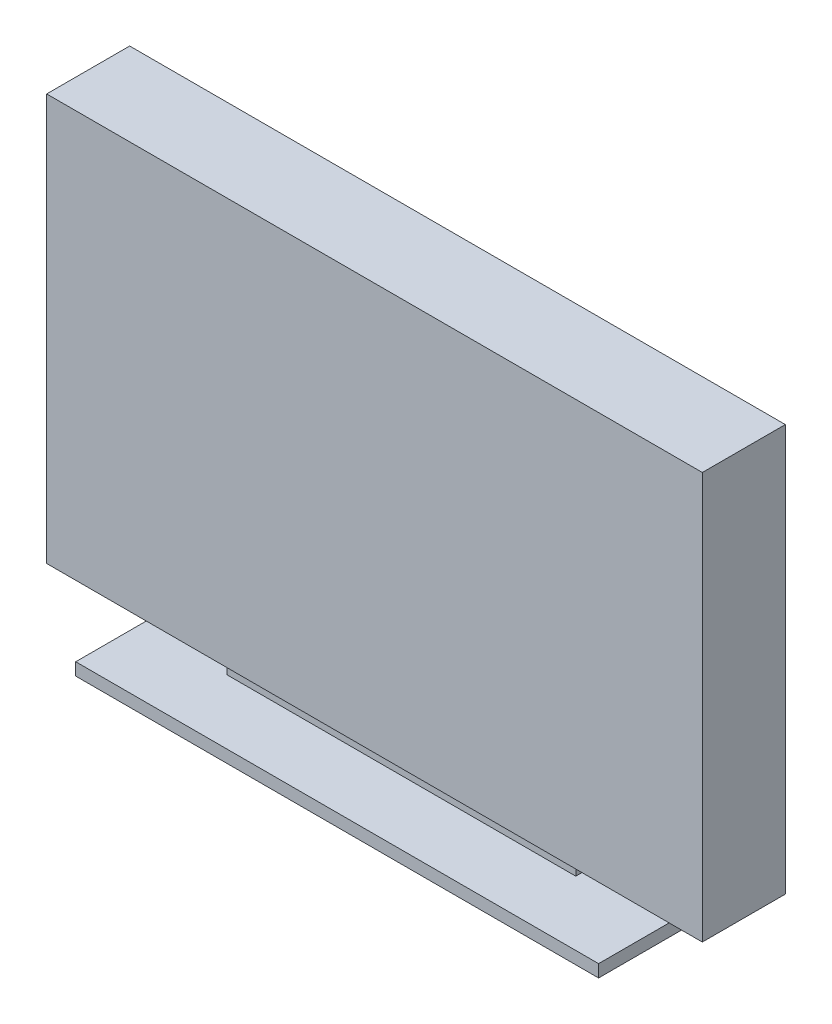
ISO-10303-21;
HEADER;
FILE_DESCRIPTION(('STEP AP214'),'2;1');
FILE_NAME('part.step','',(''),(''),'','','');
FILE_SCHEMA(('AUTOMOTIVE_DESIGN { 1 0 10303 214 1 1 1 1 }'));
ENDSEC;
DATA;
#1=APPLICATION_CONTEXT('core data for automotive mechanical design processes');
#2=APPLICATION_PROTOCOL_DEFINITION('international standard','automotive_design',2000,#1);
#3=PRODUCT_CONTEXT('',#1,'mechanical');
#4=PRODUCT('Part','Part','',(#3));
#5=PRODUCT_RELATED_PRODUCT_CATEGORY('part','',(#4));
#6=PRODUCT_DEFINITION_FORMATION('','',#4);
#7=PRODUCT_DEFINITION_CONTEXT('part definition',#1,'design');
#8=PRODUCT_DEFINITION('design','',#6,#7);
#9=PRODUCT_DEFINITION_SHAPE('','',#8);
#10=(LENGTH_UNIT() NAMED_UNIT(*) SI_UNIT(.MILLI.,.METRE.));
#11=(NAMED_UNIT(*) PLANE_ANGLE_UNIT() SI_UNIT($,.RADIAN.));
#12=(NAMED_UNIT(*) SI_UNIT($,.STERADIAN.) SOLID_ANGLE_UNIT());
#13=UNCERTAINTY_MEASURE_WITH_UNIT(LENGTH_MEASURE(1.E-05),#10,'distance_accuracy_value','');
#14=(GEOMETRIC_REPRESENTATION_CONTEXT(3) GLOBAL_UNCERTAINTY_ASSIGNED_CONTEXT((#13)) GLOBAL_UNIT_ASSIGNED_CONTEXT((#10,
#11,#12)) REPRESENTATION_CONTEXT('',''));
#15=CARTESIAN_POINT('',(0.,0.,0.));
#16=DIRECTION('',(0.,0.,1.));
#17=DIRECTION('',(1.,0.,0.));
#18=AXIS2_PLACEMENT_3D('',#15,#16,#17);
#19=CARTESIAN_POINT('',(0.,15.,0.));
#20=DIRECTION('',(0.,-1.,0.));
#21=DIRECTION('',(0.,0.,-1.));
#22=AXIS2_PLACEMENT_3D('',#19,#20,#21);
#23=PLANE('',#22);
#24=DIRECTION('',(0.,0.,-1.));
#25=VECTOR('',#24,1.);
#26=CARTESIAN_POINT('',(315.,15.,95.));
#27=LINE('',#26,#25);
#28=CARTESIAN_POINT('',(315.,15.,95.));
#29=VERTEX_POINT('',#28);
#30=CARTESIAN_POINT('',(315.,15.,-95.));
#31=VERTEX_POINT('',#30);
#32=EDGE_CURVE('E182',#29,#31,#27,.T.);
#33=ORIENTED_EDGE('',*,*,#32,.T.);
#34=DIRECTION('',(-1.,0.,0.));
#35=VECTOR('',#34,1.);
#36=CARTESIAN_POINT('',(-315.,15.,-95.));
#37=LINE('',#36,#35);
#38=CARTESIAN_POINT('',(-315.,15.,-95.));
#39=VERTEX_POINT('',#38);
#40=EDGE_CURVE('E185',#31,#39,#37,.T.);
#41=ORIENTED_EDGE('',*,*,#40,.T.);
#42=DIRECTION('',(0.,0.,1.));
#43=VECTOR('',#42,1.);
#44=CARTESIAN_POINT('',(-315.,15.,95.));
#45=LINE('',#44,#43);
#46=CARTESIAN_POINT('',(-315.,15.,95.));
#47=VERTEX_POINT('',#46);
#48=EDGE_CURVE('E188',#39,#47,#45,.T.);
#49=ORIENTED_EDGE('',*,*,#48,.T.);
#50=DIRECTION('',(1.,0.,0.));
#51=VECTOR('',#50,1.);
#52=CARTESIAN_POINT('',(-315.,15.,95.));
#53=LINE('',#52,#51);
#54=EDGE_CURVE('E190',#47,#29,#53,.T.);
#55=ORIENTED_EDGE('',*,*,#54,.T.);
#56=EDGE_LOOP('',(#33,#41,#49,#55));
#57=FACE_BOUND('',#56,.T.);
#58=DIRECTION('',(0.,0.,-1.));
#59=VECTOR('',#58,1.);
#60=CARTESIAN_POINT('',(210.,15.,17.5));
#61=LINE('',#60,#59);
#62=CARTESIAN_POINT('',(210.,15.,17.5));
#63=VERTEX_POINT('',#62);
#64=CARTESIAN_POINT('',(210.,15.,-17.5));
#65=VERTEX_POINT('',#64);
#66=EDGE_CURVE('E145',#63,#65,#61,.T.);
#67=ORIENTED_EDGE('',*,*,#66,.F.);
#68=DIRECTION('',(1.,0.,0.));
#69=VECTOR('',#68,1.);
#70=CARTESIAN_POINT('',(-210.,15.,17.5));
#71=LINE('',#70,#69);
#72=CARTESIAN_POINT('',(-210.,15.,17.5));
#73=VERTEX_POINT('',#72);
#74=EDGE_CURVE('E157',#73,#63,#71,.T.);
#75=ORIENTED_EDGE('',*,*,#74,.F.);
#76=DIRECTION('',(0.,0.,1.));
#77=VECTOR('',#76,1.);
#78=CARTESIAN_POINT('',(-210.,15.,17.5));
#79=LINE('',#78,#77);
#80=CARTESIAN_POINT('',(-210.,15.,-17.5));
#81=VERTEX_POINT('',#80);
#82=EDGE_CURVE('E53',#81,#73,#79,.T.);
#83=ORIENTED_EDGE('',*,*,#82,.F.);
#84=DIRECTION('',(-1.,0.,0.));
#85=VECTOR('',#84,1.);
#86=CARTESIAN_POINT('',(-210.,15.,-17.5));
#87=LINE('',#86,#85);
#88=EDGE_CURVE('E48',#65,#81,#87,.T.);
#89=ORIENTED_EDGE('',*,*,#88,.F.);
#90=EDGE_LOOP('',(#67,#75,#83,#89));
#91=FACE_BOUND('',#90,.T.);
#92=ADVANCED_FACE('F33',(#57,#91),#23,.F.);
#93=CARTESIAN_POINT('',(315.,15.,95.));
#94=DIRECTION('',(-1.,0.,0.));
#95=DIRECTION('',(0.,0.,1.));
#96=AXIS2_PLACEMENT_3D('',#93,#94,#95);
#97=PLANE('',#96);
#98=DIRECTION('',(0.,0.,-1.));
#99=VECTOR('',#98,1.);
#100=CARTESIAN_POINT('',(315.,0.,95.));
#101=LINE('',#100,#99);
#102=CARTESIAN_POINT('',(315.,0.,95.));
#103=VERTEX_POINT('',#102);
#104=CARTESIAN_POINT('',(315.,0.,-95.));
#105=VERTEX_POINT('',#104);
#106=EDGE_CURVE('E181',#103,#105,#101,.T.);
#107=ORIENTED_EDGE('',*,*,#106,.T.);
#108=DIRECTION('',(0.,-1.,0.));
#109=VECTOR('',#108,1.);
#110=CARTESIAN_POINT('',(315.,15.,-95.));
#111=LINE('',#110,#109);
#112=EDGE_CURVE('E11',#31,#105,#111,.T.);
#113=ORIENTED_EDGE('',*,*,#112,.F.);
#114=ORIENTED_EDGE('',*,*,#32,.F.);
#115=DIRECTION('',(0.,-1.,0.));
#116=VECTOR('',#115,1.);
#117=CARTESIAN_POINT('',(315.,15.,95.));
#118=LINE('',#117,#116);
#119=EDGE_CURVE('E192',#29,#103,#118,.T.);
#120=ORIENTED_EDGE('',*,*,#119,.T.);
#121=EDGE_LOOP('',(#107,#113,#114,#120));
#122=FACE_BOUND('',#121,.T.);
#123=ADVANCED_FACE('F35',(#122),#97,.F.);
#124=CARTESIAN_POINT('',(-315.,15.,-95.));
#125=DIRECTION('',(0.,0.,1.));
#126=DIRECTION('',(1.,0.,0.));
#127=AXIS2_PLACEMENT_3D('',#124,#125,#126);
#128=PLANE('',#127);
#129=DIRECTION('',(-1.,0.,0.));
#130=VECTOR('',#129,1.);
#131=CARTESIAN_POINT('',(-315.,0.,-95.));
#132=LINE('',#131,#130);
#133=CARTESIAN_POINT('',(-315.,0.,-95.));
#134=VERTEX_POINT('',#133);
#135=EDGE_CURVE('E195',#105,#134,#132,.T.);
#136=ORIENTED_EDGE('',*,*,#135,.T.);
#137=DIRECTION('',(0.,-1.,0.));
#138=VECTOR('',#137,1.);
#139=CARTESIAN_POINT('',(-315.,15.,-95.));
#140=LINE('',#139,#138);
#141=EDGE_CURVE('E41',#39,#134,#140,.T.);
#142=ORIENTED_EDGE('',*,*,#141,.F.);
#143=ORIENTED_EDGE('',*,*,#40,.F.);
#144=ORIENTED_EDGE('',*,*,#112,.T.);
#145=EDGE_LOOP('',(#136,#142,#143,#144));
#146=FACE_BOUND('',#145,.T.);
#147=ADVANCED_FACE('F224',(#146),#128,.F.);
#148=CARTESIAN_POINT('',(-315.,15.,95.));
#149=DIRECTION('',(1.,0.,0.));
#150=DIRECTION('',(0.,0.,-1.));
#151=AXIS2_PLACEMENT_3D('',#148,#149,#150);
#152=PLANE('',#151);
#153=DIRECTION('',(0.,0.,1.));
#154=VECTOR('',#153,1.);
#155=CARTESIAN_POINT('',(-315.,0.,95.));
#156=LINE('',#155,#154);
#157=CARTESIAN_POINT('',(-315.,0.,95.));
#158=VERTEX_POINT('',#157);
#159=EDGE_CURVE('E197',#134,#158,#156,.T.);
#160=ORIENTED_EDGE('',*,*,#159,.T.);
#161=DIRECTION('',(0.,-1.,0.));
#162=VECTOR('',#161,1.);
#163=CARTESIAN_POINT('',(-315.,15.,95.));
#164=LINE('',#163,#162);
#165=EDGE_CURVE('E202',#47,#158,#164,.T.);
#166=ORIENTED_EDGE('',*,*,#165,.F.);
#167=ORIENTED_EDGE('',*,*,#48,.F.);
#168=ORIENTED_EDGE('',*,*,#141,.T.);
#169=EDGE_LOOP('',(#160,#166,#167,#168));
#170=FACE_BOUND('',#169,.T.);
#171=ADVANCED_FACE('F209',(#170),#152,.F.);
#172=CARTESIAN_POINT('',(-315.,15.,95.));
#173=DIRECTION('',(0.,0.,-1.));
#174=DIRECTION('',(-1.,0.,0.));
#175=AXIS2_PLACEMENT_3D('',#172,#173,#174);
#176=PLANE('',#175);
#177=DIRECTION('',(1.,0.,0.));
#178=VECTOR('',#177,1.);
#179=CARTESIAN_POINT('',(-315.,0.,95.));
#180=LINE('',#179,#178);
#181=EDGE_CURVE('E186',#158,#103,#180,.T.);
#182=ORIENTED_EDGE('',*,*,#181,.T.);
#183=ORIENTED_EDGE('',*,*,#119,.F.);
#184=ORIENTED_EDGE('',*,*,#54,.F.);
#185=ORIENTED_EDGE('',*,*,#165,.T.);
#186=EDGE_LOOP('',(#182,#183,#184,#185));
#187=FACE_BOUND('',#186,.T.);
#188=ADVANCED_FACE('F218',(#187),#176,.F.);
#189=CARTESIAN_POINT('',(0.,0.,0.));
#190=DIRECTION('',(0.,-1.,0.));
#191=DIRECTION('',(0.,0.,-1.));
#192=AXIS2_PLACEMENT_3D('',#189,#190,#191);
#193=PLANE('',#192);
#194=ORIENTED_EDGE('',*,*,#106,.F.);
#195=ORIENTED_EDGE('',*,*,#181,.F.);
#196=ORIENTED_EDGE('',*,*,#159,.F.);
#197=ORIENTED_EDGE('',*,*,#135,.F.);
#198=EDGE_LOOP('',(#194,#195,#196,#197));
#199=FACE_BOUND('',#198,.T.);
#200=ADVANCED_FACE('F215',(#199),#193,.T.);
#201=CARTESIAN_POINT('',(210.,55.,17.5));
#202=DIRECTION('',(-1.,0.,0.));
#203=DIRECTION('',(0.,0.,1.));
#204=AXIS2_PLACEMENT_3D('',#201,#202,#203);
#205=PLANE('',#204);
#206=ORIENTED_EDGE('',*,*,#66,.T.);
#207=DIRECTION('',(0.,-1.,0.));
#208=VECTOR('',#207,1.);
#209=CARTESIAN_POINT('',(210.,55.,-17.5));
#210=LINE('',#209,#208);
#211=CARTESIAN_POINT('',(210.,55.,-17.5));
#212=VERTEX_POINT('',#211);
#213=EDGE_CURVE('E179',#212,#65,#210,.T.);
#214=ORIENTED_EDGE('',*,*,#213,.F.);
#215=DIRECTION('',(0.,0.,-1.));
#216=VECTOR('',#215,1.);
#217=CARTESIAN_POINT('',(210.,55.,17.5));
#218=LINE('',#217,#216);
#219=CARTESIAN_POINT('',(210.,55.,17.5));
#220=VERTEX_POINT('',#219);
#221=EDGE_CURVE('E153',#220,#212,#218,.T.);
#222=ORIENTED_EDGE('',*,*,#221,.F.);
#223=DIRECTION('',(0.,-1.,0.));
#224=VECTOR('',#223,1.);
#225=CARTESIAN_POINT('',(210.,55.,17.5));
#226=LINE('',#225,#224);
#227=EDGE_CURVE('E165',#220,#63,#226,.T.);
#228=ORIENTED_EDGE('',*,*,#227,.T.);
#229=EDGE_LOOP('',(#206,#214,#222,#228));
#230=FACE_BOUND('',#229,.T.);
#231=ADVANCED_FACE('F237',(#230),#205,.F.);
#232=CARTESIAN_POINT('',(-210.,55.,-17.5));
#233=DIRECTION('',(0.,0.,1.));
#234=DIRECTION('',(1.,0.,0.));
#235=AXIS2_PLACEMENT_3D('',#232,#233,#234);
#236=PLANE('',#235);
#237=ORIENTED_EDGE('',*,*,#88,.T.);
#238=DIRECTION('',(0.,-1.,0.));
#239=VECTOR('',#238,1.);
#240=CARTESIAN_POINT('',(-210.,55.,-17.5));
#241=LINE('',#240,#239);
#242=CARTESIAN_POINT('',(-210.,55.,-17.5));
#243=VERTEX_POINT('',#242);
#244=EDGE_CURVE('E176',#243,#81,#241,.T.);
#245=ORIENTED_EDGE('',*,*,#244,.F.);
#246=DIRECTION('',(-1.,0.,0.));
#247=VECTOR('',#246,1.);
#248=CARTESIAN_POINT('',(-210.,55.,-17.5));
#249=LINE('',#248,#247);
#250=EDGE_CURVE('E156',#212,#243,#249,.T.);
#251=ORIENTED_EDGE('',*,*,#250,.F.);
#252=ORIENTED_EDGE('',*,*,#213,.T.);
#253=EDGE_LOOP('',(#237,#245,#251,#252));
#254=FACE_BOUND('',#253,.T.);
#255=ADVANCED_FACE('F256',(#254),#236,.F.);
#256=CARTESIAN_POINT('',(-210.,55.,17.5));
#257=DIRECTION('',(1.,0.,0.));
#258=DIRECTION('',(0.,0.,-1.));
#259=AXIS2_PLACEMENT_3D('',#256,#257,#258);
#260=PLANE('',#259);
#261=ORIENTED_EDGE('',*,*,#82,.T.);
#262=DIRECTION('',(0.,-1.,0.));
#263=VECTOR('',#262,1.);
#264=CARTESIAN_POINT('',(-210.,55.,17.5));
#265=LINE('',#264,#263);
#266=CARTESIAN_POINT('',(-210.,55.,17.5));
#267=VERTEX_POINT('',#266);
#268=EDGE_CURVE('E173',#267,#73,#265,.T.);
#269=ORIENTED_EDGE('',*,*,#268,.F.);
#270=DIRECTION('',(0.,0.,1.));
#271=VECTOR('',#270,1.);
#272=CARTESIAN_POINT('',(-210.,55.,17.5));
#273=LINE('',#272,#271);
#274=EDGE_CURVE('E160',#243,#267,#273,.T.);
#275=ORIENTED_EDGE('',*,*,#274,.F.);
#276=ORIENTED_EDGE('',*,*,#244,.T.);
#277=EDGE_LOOP('',(#261,#269,#275,#276));
#278=FACE_BOUND('',#277,.T.);
#279=ADVANCED_FACE('F263',(#278),#260,.F.);
#280=CARTESIAN_POINT('',(-210.,55.,17.5));
#281=DIRECTION('',(0.,0.,-1.));
#282=DIRECTION('',(-1.,0.,0.));
#283=AXIS2_PLACEMENT_3D('',#280,#281,#282);
#284=PLANE('',#283);
#285=ORIENTED_EDGE('',*,*,#74,.T.);
#286=ORIENTED_EDGE('',*,*,#227,.F.);
#287=DIRECTION('',(1.,0.,0.));
#288=VECTOR('',#287,1.);
#289=CARTESIAN_POINT('',(-210.,55.,17.5));
#290=LINE('',#289,#288);
#291=EDGE_CURVE('E163',#267,#220,#290,.T.);
#292=ORIENTED_EDGE('',*,*,#291,.F.);
#293=ORIENTED_EDGE('',*,*,#268,.T.);
#294=EDGE_LOOP('',(#285,#286,#292,#293));
#295=FACE_BOUND('',#294,.T.);
#296=ADVANCED_FACE('F270',(#295),#284,.F.);
#297=CARTESIAN_POINT('',(0.,55.,0.));
#298=DIRECTION('',(0.,-1.,0.));
#299=DIRECTION('',(0.,0.,-1.));
#300=AXIS2_PLACEMENT_3D('',#297,#298,#299);
#301=PLANE('',#300);
#302=DIRECTION('',(0.,0.,-1.));
#303=VECTOR('',#302,1.);
#304=CARTESIAN_POINT('',(395.,55.,50.));
#305=LINE('',#304,#303);
#306=CARTESIAN_POINT('',(395.,55.,50.));
#307=VERTEX_POINT('',#306);
#308=CARTESIAN_POINT('',(395.,55.,-50.));
#309=VERTEX_POINT('',#308);
#310=EDGE_CURVE('E144',#307,#309,#305,.T.);
#311=ORIENTED_EDGE('',*,*,#310,.F.);
#312=DIRECTION('',(1.,0.,0.));
#313=VECTOR('',#312,1.);
#314=CARTESIAN_POINT('',(-395.,55.,50.));
#315=LINE('',#314,#313);
#316=CARTESIAN_POINT('',(-395.,55.,50.));
#317=VERTEX_POINT('',#316);
#318=EDGE_CURVE('E140',#317,#307,#315,.T.);
#319=ORIENTED_EDGE('',*,*,#318,.F.);
#320=DIRECTION('',(0.,0.,1.));
#321=VECTOR('',#320,1.);
#322=CARTESIAN_POINT('',(-395.,55.,50.));
#323=LINE('',#322,#321);
#324=CARTESIAN_POINT('',(-395.,55.,-50.));
#325=VERTEX_POINT('',#324);
#326=EDGE_CURVE('E370',#325,#317,#323,.T.);
#327=ORIENTED_EDGE('',*,*,#326,.F.);
#328=DIRECTION('',(-1.,0.,0.));
#329=VECTOR('',#328,1.);
#330=CARTESIAN_POINT('',(-395.,55.,-50.));
#331=LINE('',#330,#329);
#332=EDGE_CURVE('E374',#309,#325,#331,.T.);
#333=ORIENTED_EDGE('',*,*,#332,.F.);
#334=EDGE_LOOP('',(#311,#319,#327,#333));
#335=FACE_BOUND('',#334,.T.);
#336=ORIENTED_EDGE('',*,*,#221,.T.);
#337=ORIENTED_EDGE('',*,*,#250,.T.);
#338=ORIENTED_EDGE('',*,*,#274,.T.);
#339=ORIENTED_EDGE('',*,*,#291,.T.);
#340=EDGE_LOOP('',(#336,#337,#338,#339));
#341=FACE_BOUND('',#340,.T.);
#342=ADVANCED_FACE('F278',(#335,#341),#301,.T.);
#343=CARTESIAN_POINT('',(395.,545.,50.));
#344=DIRECTION('',(-1.,0.,0.));
#345=DIRECTION('',(0.,0.,1.));
#346=AXIS2_PLACEMENT_3D('',#343,#344,#345);
#347=PLANE('',#346);
#348=ORIENTED_EDGE('',*,*,#310,.T.);
#349=DIRECTION('',(0.,-1.,0.));
#350=VECTOR('',#349,1.);
#351=CARTESIAN_POINT('',(395.,545.,-50.));
#352=LINE('',#351,#350);
#353=CARTESIAN_POINT('',(395.,545.,-50.));
#354=VERTEX_POINT('',#353);
#355=EDGE_CURVE('E124',#354,#309,#352,.T.);
#356=ORIENTED_EDGE('',*,*,#355,.F.);
#357=DIRECTION('',(0.,0.,-1.));
#358=VECTOR('',#357,1.);
#359=CARTESIAN_POINT('',(395.,545.,50.));
#360=LINE('',#359,#358);
#361=CARTESIAN_POINT('',(395.,545.,50.));
#362=VERTEX_POINT('',#361);
#363=EDGE_CURVE('E131',#362,#354,#360,.T.);
#364=ORIENTED_EDGE('',*,*,#363,.F.);
#365=DIRECTION('',(0.,-1.,0.));
#366=VECTOR('',#365,1.);
#367=CARTESIAN_POINT('',(395.,545.,50.));
#368=LINE('',#367,#366);
#369=EDGE_CURVE('E367',#362,#307,#368,.T.);
#370=ORIENTED_EDGE('',*,*,#369,.T.);
#371=EDGE_LOOP('',(#348,#356,#364,#370));
#372=FACE_BOUND('',#371,.T.);
#373=ADVANCED_FACE('F142',(#372),#347,.F.);
#374=CARTESIAN_POINT('',(-395.,545.,-50.));
#375=DIRECTION('',(0.,0.,1.));
#376=DIRECTION('',(1.,0.,0.));
#377=AXIS2_PLACEMENT_3D('',#374,#375,#376);
#378=PLANE('',#377);
#379=ORIENTED_EDGE('',*,*,#332,.T.);
#380=DIRECTION('',(0.,-1.,0.));
#381=VECTOR('',#380,1.);
#382=CARTESIAN_POINT('',(-395.,545.,-50.));
#383=LINE('',#382,#381);
#384=CARTESIAN_POINT('',(-395.,545.,-50.));
#385=VERTEX_POINT('',#384);
#386=EDGE_CURVE('E127',#385,#325,#383,.T.);
#387=ORIENTED_EDGE('',*,*,#386,.F.);
#388=DIRECTION('',(-1.,0.,0.));
#389=VECTOR('',#388,1.);
#390=CARTESIAN_POINT('',(-395.,545.,-50.));
#391=LINE('',#390,#389);
#392=EDGE_CURVE('E120',#354,#385,#391,.T.);
#393=ORIENTED_EDGE('',*,*,#392,.F.);
#394=ORIENTED_EDGE('',*,*,#355,.T.);
#395=EDGE_LOOP('',(#379,#387,#393,#394));
#396=FACE_BOUND('',#395,.T.);
#397=ADVANCED_FACE('F122',(#396),#378,.F.);
#398=CARTESIAN_POINT('',(-395.,545.,50.));
#399=DIRECTION('',(1.,0.,0.));
#400=DIRECTION('',(0.,0.,-1.));
#401=AXIS2_PLACEMENT_3D('',#398,#399,#400);
#402=PLANE('',#401);
#403=ORIENTED_EDGE('',*,*,#326,.T.);
#404=DIRECTION('',(0.,-1.,0.));
#405=VECTOR('',#404,1.);
#406=CARTESIAN_POINT('',(-395.,545.,50.));
#407=LINE('',#406,#405);
#408=CARTESIAN_POINT('',(-395.,545.,50.));
#409=VERTEX_POINT('',#408);
#410=EDGE_CURVE('E149',#409,#317,#407,.T.);
#411=ORIENTED_EDGE('',*,*,#410,.F.);
#412=DIRECTION('',(0.,0.,1.));
#413=VECTOR('',#412,1.);
#414=CARTESIAN_POINT('',(-395.,545.,50.));
#415=LINE('',#414,#413);
#416=EDGE_CURVE('E130',#385,#409,#415,.T.);
#417=ORIENTED_EDGE('',*,*,#416,.F.);
#418=ORIENTED_EDGE('',*,*,#386,.T.);
#419=EDGE_LOOP('',(#403,#411,#417,#418));
#420=FACE_BOUND('',#419,.T.);
#421=ADVANCED_FACE('F299',(#420),#402,.F.);
#422=CARTESIAN_POINT('',(-395.,545.,50.));
#423=DIRECTION('',(0.,0.,-1.));
#424=DIRECTION('',(-1.,0.,0.));
#425=AXIS2_PLACEMENT_3D('',#422,#423,#424);
#426=PLANE('',#425);
#427=ORIENTED_EDGE('',*,*,#318,.T.);
#428=ORIENTED_EDGE('',*,*,#369,.F.);
#429=DIRECTION('',(1.,0.,0.));
#430=VECTOR('',#429,1.);
#431=CARTESIAN_POINT('',(-395.,545.,50.));
#432=LINE('',#431,#430);
#433=EDGE_CURVE('E136',#409,#362,#432,.T.);
#434=ORIENTED_EDGE('',*,*,#433,.F.);
#435=ORIENTED_EDGE('',*,*,#410,.T.);
#436=EDGE_LOOP('',(#427,#428,#434,#435));
#437=FACE_BOUND('',#436,.T.);
#438=ADVANCED_FACE('F306',(#437),#426,.F.);
#439=CARTESIAN_POINT('',(0.,545.,0.));
#440=DIRECTION('',(0.,-1.,0.));
#441=DIRECTION('',(0.,0.,-1.));
#442=AXIS2_PLACEMENT_3D('',#439,#440,#441);
#443=PLANE('',#442);
#444=ORIENTED_EDGE('',*,*,#363,.T.);
#445=ORIENTED_EDGE('',*,*,#392,.T.);
#446=ORIENTED_EDGE('',*,*,#416,.T.);
#447=ORIENTED_EDGE('',*,*,#433,.T.);
#448=EDGE_LOOP('',(#444,#445,#446,#447));
#449=FACE_BOUND('',#448,.T.);
#450=ADVANCED_FACE('F134',(#449),#443,.F.);
#451=CLOSED_SHELL('',(#92,#123,#147,#171,#188,#200,#231,#255,#279,#296,#342,#373,#397,#421,#438,#450));
#452=MANIFOLD_SOLID_BREP('B2',#451);
#453=ADVANCED_BREP_SHAPE_REPRESENTATION('',(#18,#452),#14);
#454=SHAPE_DEFINITION_REPRESENTATION(#9,#453);
ENDSEC;
END-ISO-10303-21;
